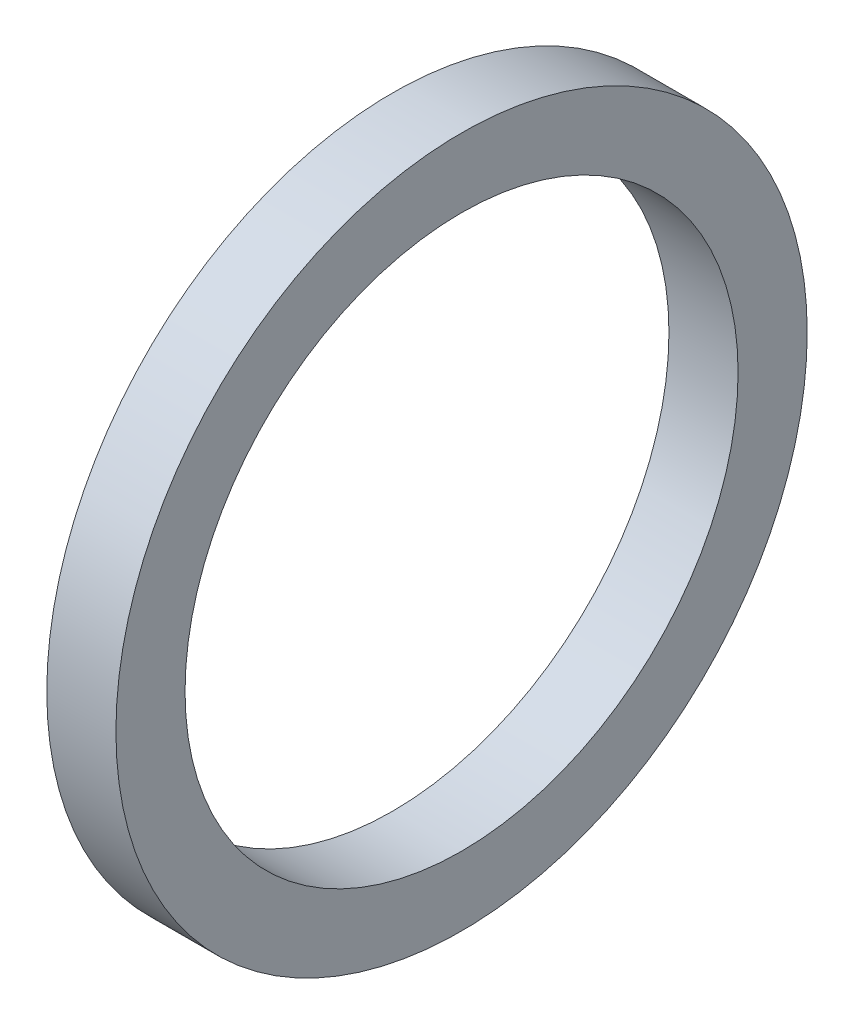
ISO-10303-21;
HEADER;
FILE_DESCRIPTION(('STEP AP214'),'2;1');
FILE_NAME('part.step','',(''),(''),'','','');
FILE_SCHEMA(('AUTOMOTIVE_DESIGN { 1 0 10303 214 1 1 1 1 }'));
ENDSEC;
DATA;
#1=APPLICATION_CONTEXT('core data for automotive mechanical design processes');
#2=APPLICATION_PROTOCOL_DEFINITION('international standard','automotive_design',2000,#1);
#3=PRODUCT_CONTEXT('',#1,'mechanical');
#4=PRODUCT('Part','Part','',(#3));
#5=PRODUCT_RELATED_PRODUCT_CATEGORY('part','',(#4));
#6=PRODUCT_DEFINITION_FORMATION('','',#4);
#7=PRODUCT_DEFINITION_CONTEXT('part definition',#1,'design');
#8=PRODUCT_DEFINITION('design','',#6,#7);
#9=PRODUCT_DEFINITION_SHAPE('','',#8);
#10=(LENGTH_UNIT() NAMED_UNIT(*) SI_UNIT(.MILLI.,.METRE.));
#11=(NAMED_UNIT(*) PLANE_ANGLE_UNIT() SI_UNIT($,.RADIAN.));
#12=(NAMED_UNIT(*) SI_UNIT($,.STERADIAN.) SOLID_ANGLE_UNIT());
#13=UNCERTAINTY_MEASURE_WITH_UNIT(LENGTH_MEASURE(1.E-05),#10,'distance_accuracy_value','');
#14=(GEOMETRIC_REPRESENTATION_CONTEXT(3) GLOBAL_UNCERTAINTY_ASSIGNED_CONTEXT((#13)) GLOBAL_UNIT_ASSIGNED_CONTEXT((#10,
#11,#12)) REPRESENTATION_CONTEXT('',''));
#15=CARTESIAN_POINT('',(0.,0.,0.));
#16=DIRECTION('',(0.,0.,1.));
#17=DIRECTION('',(1.,0.,0.));
#18=AXIS2_PLACEMENT_3D('',#15,#16,#17);
#19=CARTESIAN_POINT('',(0.,10.,0.));
#20=DIRECTION('',(1.,0.,0.));
#21=DIRECTION('',(0.,0.,-1.));
#22=AXIS2_PLACEMENT_3D('',#19,#20,#21);
#23=PLANE('',#22);
#24=CARTESIAN_POINT('',(0.,0.,0.));
#25=DIRECTION('',(-1.,0.,0.));
#26=DIRECTION('',(0.,0.,1.));
#27=AXIS2_PLACEMENT_3D('',#24,#25,#26);
#28=CIRCLE('',#27,8.);
#29=CARTESIAN_POINT('',(0.,0.,8.));
#30=VERTEX_POINT('',#29);
#31=EDGE_CURVE('E10',#30,#30,#28,.T.);
#32=ORIENTED_EDGE('',*,*,#31,.F.);
#33=EDGE_LOOP('',(#32));
#34=FACE_BOUND('',#33,.T.);
#35=CARTESIAN_POINT('',(0.,0.,0.));
#36=DIRECTION('',(-1.,0.,0.));
#37=DIRECTION('',(0.,0.,1.));
#38=AXIS2_PLACEMENT_3D('',#35,#36,#37);
#39=CIRCLE('',#38,10.);
#40=CARTESIAN_POINT('',(0.,0.,10.));
#41=VERTEX_POINT('',#40);
#42=EDGE_CURVE('E45',#41,#41,#39,.T.);
#43=ORIENTED_EDGE('',*,*,#42,.T.);
#44=EDGE_LOOP('',(#43));
#45=FACE_BOUND('',#44,.T.);
#46=ADVANCED_FACE('F31',(#34,#45),#23,.F.);
#47=CARTESIAN_POINT('',(2.,0.,0.));
#48=DIRECTION('',(-1.,0.,0.));
#49=DIRECTION('',(0.,0.,1.));
#50=AXIS2_PLACEMENT_3D('',#47,#48,#49);
#51=CYLINDRICAL_SURFACE('',#50,8.);
#52=CARTESIAN_POINT('',(2.,0.,0.));
#53=DIRECTION('',(-1.,0.,0.));
#54=DIRECTION('',(0.,0.,1.));
#55=AXIS2_PLACEMENT_3D('',#52,#53,#54);
#56=CIRCLE('',#55,8.);
#57=CARTESIAN_POINT('',(2.,0.,8.));
#58=VERTEX_POINT('',#57);
#59=EDGE_CURVE('E37',#58,#58,#56,.T.);
#60=ORIENTED_EDGE('',*,*,#59,.F.);
#61=EDGE_LOOP('',(#60));
#62=FACE_BOUND('',#61,.T.);
#63=ORIENTED_EDGE('',*,*,#31,.T.);
#64=EDGE_LOOP('',(#63));
#65=FACE_BOUND('',#64,.T.);
#66=ADVANCED_FACE('F60',(#62,#65),#51,.F.);
#67=CARTESIAN_POINT('',(2.,8.,0.));
#68=DIRECTION('',(-1.,0.,0.));
#69=DIRECTION('',(0.,0.,1.));
#70=AXIS2_PLACEMENT_3D('',#67,#68,#69);
#71=PLANE('',#70);
#72=CARTESIAN_POINT('',(2.,0.,0.));
#73=DIRECTION('',(-1.,0.,0.));
#74=DIRECTION('',(0.,0.,1.));
#75=AXIS2_PLACEMENT_3D('',#72,#73,#74);
#76=CIRCLE('',#75,10.);
#77=CARTESIAN_POINT('',(2.,0.,10.));
#78=VERTEX_POINT('',#77);
#79=EDGE_CURVE('E41',#78,#78,#76,.T.);
#80=ORIENTED_EDGE('',*,*,#79,.F.);
#81=EDGE_LOOP('',(#80));
#82=FACE_BOUND('',#81,.T.);
#83=ORIENTED_EDGE('',*,*,#59,.T.);
#84=EDGE_LOOP('',(#83));
#85=FACE_BOUND('',#84,.T.);
#86=ADVANCED_FACE('F55',(#82,#85),#71,.F.);
#87=CARTESIAN_POINT('',(2.,0.,0.));
#88=DIRECTION('',(-1.,0.,0.));
#89=DIRECTION('',(0.,0.,1.));
#90=AXIS2_PLACEMENT_3D('',#87,#88,#89);
#91=CYLINDRICAL_SURFACE('',#90,10.);
#92=ORIENTED_EDGE('',*,*,#42,.F.);
#93=EDGE_LOOP('',(#92));
#94=FACE_BOUND('',#93,.T.);
#95=ORIENTED_EDGE('',*,*,#79,.T.);
#96=EDGE_LOOP('',(#95));
#97=FACE_BOUND('',#96,.T.);
#98=ADVANCED_FACE('F52',(#94,#97),#91,.T.);
#99=CLOSED_SHELL('',(#46,#66,#86,#98));
#100=MANIFOLD_SOLID_BREP('B2',#99);
#101=ADVANCED_BREP_SHAPE_REPRESENTATION('',(#18,#100),#14);
#102=SHAPE_DEFINITION_REPRESENTATION(#9,#101);
ENDSEC;
END-ISO-10303-21;
